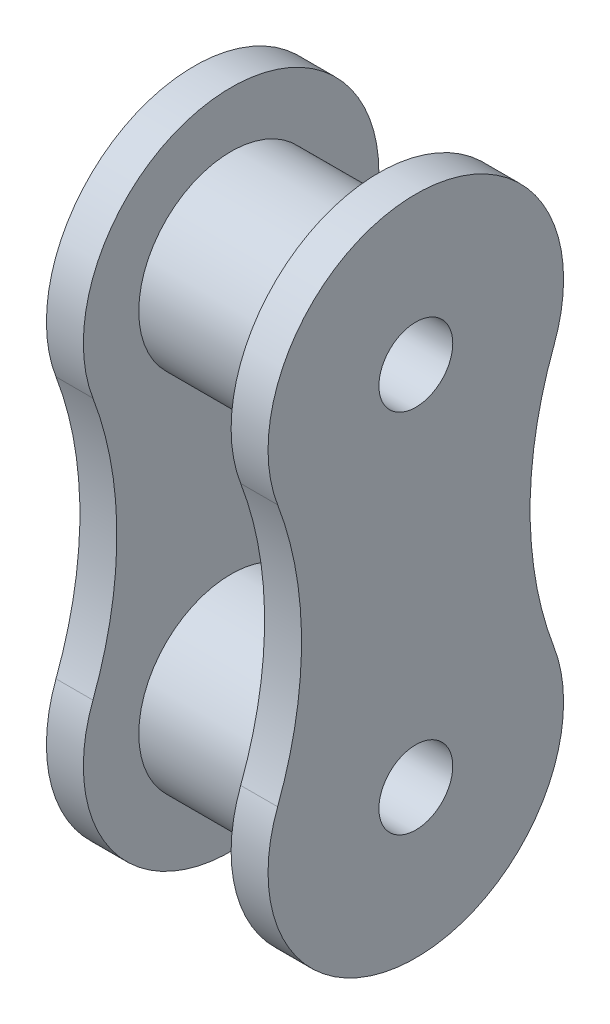
ISO-10303-21;
HEADER;
FILE_DESCRIPTION(('STEP AP214'),'2;1');
FILE_NAME('part.step','',(''),(''),'','','');
FILE_SCHEMA(('AUTOMOTIVE_DESIGN { 1 0 10303 214 1 1 1 1 }'));
ENDSEC;
DATA;
#1=APPLICATION_CONTEXT('core data for automotive mechanical design processes');
#2=APPLICATION_PROTOCOL_DEFINITION('international standard','automotive_design',2000,#1);
#3=PRODUCT_CONTEXT('',#1,'mechanical');
#4=PRODUCT('Part','Part','',(#3));
#5=PRODUCT_RELATED_PRODUCT_CATEGORY('part','',(#4));
#6=PRODUCT_DEFINITION_FORMATION('','',#4);
#7=PRODUCT_DEFINITION_CONTEXT('part definition',#1,'design');
#8=PRODUCT_DEFINITION('design','',#6,#7);
#9=PRODUCT_DEFINITION_SHAPE('','',#8);
#10=(LENGTH_UNIT() NAMED_UNIT(*) SI_UNIT(.MILLI.,.METRE.));
#11=(NAMED_UNIT(*) PLANE_ANGLE_UNIT() SI_UNIT($,.RADIAN.));
#12=(NAMED_UNIT(*) SI_UNIT($,.STERADIAN.) SOLID_ANGLE_UNIT());
#13=UNCERTAINTY_MEASURE_WITH_UNIT(LENGTH_MEASURE(1.E-05),#10,'distance_accuracy_value','');
#14=(GEOMETRIC_REPRESENTATION_CONTEXT(3) GLOBAL_UNCERTAINTY_ASSIGNED_CONTEXT((#13)) GLOBAL_UNIT_ASSIGNED_CONTEXT((#10,
#11,#12)) REPRESENTATION_CONTEXT('',''));
#15=CARTESIAN_POINT('',(0.,0.,0.));
#16=DIRECTION('',(0.,0.,1.));
#17=DIRECTION('',(1.,0.,0.));
#18=AXIS2_PLACEMENT_3D('',#15,#16,#17);
#19=CARTESIAN_POINT('',(2.5,-4.955,0.));
#20=DIRECTION('',(-1.,0.,0.));
#21=DIRECTION('',(0.,0.,1.));
#22=AXIS2_PLACEMENT_3D('',#19,#20,#21);
#23=CYLINDRICAL_SURFACE('',#22,2.5);
#24=CARTESIAN_POINT('',(2.,-4.955,0.));
#25=DIRECTION('',(1.,0.,0.));
#26=DIRECTION('',(0.,0.,-1.));
#27=AXIS2_PLACEMENT_3D('',#24,#25,#26);
#28=CIRCLE('',#27,2.5);
#29=CARTESIAN_POINT('',(2.,-4.955,-2.5));
#30=VERTEX_POINT('',#29);
#31=EDGE_CURVE('E186',#30,#30,#28,.T.);
#32=ORIENTED_EDGE('',*,*,#31,.F.);
#33=EDGE_LOOP('',(#32));
#34=FACE_BOUND('',#33,.T.);
#35=CARTESIAN_POINT('',(-2.,-4.955,0.));
#36=DIRECTION('',(-1.,0.,0.));
#37=DIRECTION('',(0.,0.,1.));
#38=AXIS2_PLACEMENT_3D('',#35,#36,#37);
#39=CIRCLE('',#38,2.5);
#40=CARTESIAN_POINT('',(-2.,-4.955,2.5));
#41=VERTEX_POINT('',#40);
#42=EDGE_CURVE('E11',#41,#41,#39,.T.);
#43=ORIENTED_EDGE('',*,*,#42,.F.);
#44=EDGE_LOOP('',(#43));
#45=FACE_BOUND('',#44,.T.);
#46=ADVANCED_FACE('F44',(#34,#45),#23,.T.);
#47=CARTESIAN_POINT('',(2.5,4.955,0.));
#48=DIRECTION('',(-1.,0.,0.));
#49=DIRECTION('',(0.,0.,1.));
#50=AXIS2_PLACEMENT_3D('',#47,#48,#49);
#51=CYLINDRICAL_SURFACE('',#50,2.5);
#52=CARTESIAN_POINT('',(2.,4.955,0.));
#53=DIRECTION('',(1.,0.,0.));
#54=DIRECTION('',(0.,0.,-1.));
#55=AXIS2_PLACEMENT_3D('',#52,#53,#54);
#56=CIRCLE('',#55,2.5);
#57=CARTESIAN_POINT('',(2.,4.955,-2.5));
#58=VERTEX_POINT('',#57);
#59=EDGE_CURVE('E188',#58,#58,#56,.F.);
#60=ORIENTED_EDGE('',*,*,#59,.T.);
#61=EDGE_LOOP('',(#60));
#62=FACE_BOUND('',#61,.T.);
#63=CARTESIAN_POINT('',(-2.,4.955,0.));
#64=DIRECTION('',(-1.,0.,0.));
#65=DIRECTION('',(0.,0.,1.));
#66=AXIS2_PLACEMENT_3D('',#63,#64,#65);
#67=CIRCLE('',#66,2.5);
#68=CARTESIAN_POINT('',(-2.,4.955,2.5));
#69=VERTEX_POINT('',#68);
#70=EDGE_CURVE('E48',#69,#69,#67,.T.);
#71=ORIENTED_EDGE('',*,*,#70,.F.);
#72=EDGE_LOOP('',(#71));
#73=FACE_BOUND('',#72,.T.);
#74=ADVANCED_FACE('F200',(#62,#73),#51,.T.);
#75=CARTESIAN_POINT('',(3.,-4.955,0.));
#76=DIRECTION('',(-1.,0.,0.));
#77=DIRECTION('',(0.,0.,1.));
#78=AXIS2_PLACEMENT_3D('',#75,#76,#77);
#79=CYLINDRICAL_SURFACE('',#78,4.);
#80=CARTESIAN_POINT('',(2.,-4.955,0.));
#81=DIRECTION('',(1.,0.,0.));
#82=DIRECTION('',(0.,0.,-1.));
#83=AXIS2_PLACEMENT_3D('',#80,#81,#82);
#84=CIRCLE('',#83,4.);
#85=CARTESIAN_POINT('',(2.,-3.53928571428571,3.74108982266191));
#86=VERTEX_POINT('',#85);
#87=CARTESIAN_POINT('',(2.,-3.53928571428571,-3.74108982266191));
#88=VERTEX_POINT('',#87);
#89=EDGE_CURVE('E130',#86,#88,#84,.T.);
#90=ORIENTED_EDGE('',*,*,#89,.T.);
#91=DIRECTION('',(-1.,0.,0.));
#92=VECTOR('',#91,1.);
#93=CARTESIAN_POINT('',(3.,-3.53928571428571,-3.74108982266191));
#94=LINE('',#93,#92);
#95=CARTESIAN_POINT('',(3.,-3.53928571428571,-3.74108982266191));
#96=VERTEX_POINT('',#95);
#97=EDGE_CURVE('E183',#96,#88,#94,.T.);
#98=ORIENTED_EDGE('',*,*,#97,.F.);
#99=CARTESIAN_POINT('',(3.,-4.955,0.));
#100=DIRECTION('',(1.,0.,0.));
#101=DIRECTION('',(0.,0.,-1.));
#102=AXIS2_PLACEMENT_3D('',#99,#100,#101);
#103=CIRCLE('',#102,4.);
#104=CARTESIAN_POINT('',(3.,-3.53928571428571,3.74108982266191));
#105=VERTEX_POINT('',#104);
#106=EDGE_CURVE('E162',#105,#96,#103,.T.);
#107=ORIENTED_EDGE('',*,*,#106,.F.);
#108=DIRECTION('',(-1.,0.,0.));
#109=VECTOR('',#108,1.);
#110=CARTESIAN_POINT('',(3.,-3.53928571428571,3.74108982266191));
#111=LINE('',#110,#109);
#112=EDGE_CURVE('E61',#105,#86,#111,.T.);
#113=ORIENTED_EDGE('',*,*,#112,.T.);
#114=EDGE_LOOP('',(#90,#98,#107,#113));
#115=FACE_BOUND('',#114,.T.);
#116=ADVANCED_FACE('F203',(#115),#79,.T.);
#117=CARTESIAN_POINT('',(3.,0.,-13.0938143793167));
#118=DIRECTION('',(-1.,0.,0.));
#119=DIRECTION('',(0.,0.,1.));
#120=AXIS2_PLACEMENT_3D('',#117,#118,#119);
#121=CYLINDRICAL_SURFACE('',#120,10.);
#122=CARTESIAN_POINT('',(2.,0.,-13.0938143793167));
#123=DIRECTION('',(1.,0.,0.));
#124=DIRECTION('',(0.,0.,-1.));
#125=AXIS2_PLACEMENT_3D('',#122,#123,#124);
#126=CIRCLE('',#125,10.);
#127=CARTESIAN_POINT('',(2.,3.53928571428571,-3.74108982266191));
#128=VERTEX_POINT('',#127);
#129=EDGE_CURVE('E175',#88,#128,#126,.F.);
#130=ORIENTED_EDGE('',*,*,#129,.T.);
#131=DIRECTION('',(-1.,0.,0.));
#132=VECTOR('',#131,1.);
#133=CARTESIAN_POINT('',(3.,3.53928571428571,-3.74108982266191));
#134=LINE('',#133,#132);
#135=CARTESIAN_POINT('',(3.,3.53928571428571,-3.74108982266191));
#136=VERTEX_POINT('',#135);
#137=EDGE_CURVE('E181',#136,#128,#134,.T.);
#138=ORIENTED_EDGE('',*,*,#137,.F.);
#139=CARTESIAN_POINT('',(3.,0.,-13.0938143793167));
#140=DIRECTION('',(1.,0.,0.));
#141=DIRECTION('',(0.,0.,-1.));
#142=AXIS2_PLACEMENT_3D('',#139,#140,#141);
#143=CIRCLE('',#142,10.);
#144=EDGE_CURVE('E90',#96,#136,#143,.F.);
#145=ORIENTED_EDGE('',*,*,#144,.F.);
#146=ORIENTED_EDGE('',*,*,#97,.T.);
#147=EDGE_LOOP('',(#130,#138,#145,#146));
#148=FACE_BOUND('',#147,.T.);
#149=ADVANCED_FACE('F208',(#148),#121,.F.);
#150=CARTESIAN_POINT('',(3.,4.955,0.));
#151=DIRECTION('',(-1.,0.,0.));
#152=DIRECTION('',(0.,0.,1.));
#153=AXIS2_PLACEMENT_3D('',#150,#151,#152);
#154=CYLINDRICAL_SURFACE('',#153,4.);
#155=CARTESIAN_POINT('',(2.,4.955,0.));
#156=DIRECTION('',(1.,0.,0.));
#157=DIRECTION('',(0.,0.,-1.));
#158=AXIS2_PLACEMENT_3D('',#155,#156,#157);
#159=CIRCLE('',#158,4.);
#160=CARTESIAN_POINT('',(2.,3.53928571428571,3.74108982266191));
#161=VERTEX_POINT('',#160);
#162=EDGE_CURVE('E176',#161,#128,#159,.F.);
#163=ORIENTED_EDGE('',*,*,#162,.F.);
#164=DIRECTION('',(-1.,0.,0.));
#165=VECTOR('',#164,1.);
#166=CARTESIAN_POINT('',(3.,3.53928571428571,3.74108982266191));
#167=LINE('',#166,#165);
#168=CARTESIAN_POINT('',(3.,3.53928571428571,3.74108982266191));
#169=VERTEX_POINT('',#168);
#170=EDGE_CURVE('E76',#169,#161,#167,.T.);
#171=ORIENTED_EDGE('',*,*,#170,.F.);
#172=CARTESIAN_POINT('',(3.,4.955,0.));
#173=DIRECTION('',(1.,0.,0.));
#174=DIRECTION('',(0.,0.,-1.));
#175=AXIS2_PLACEMENT_3D('',#172,#173,#174);
#176=CIRCLE('',#175,4.);
#177=EDGE_CURVE('E170',#169,#136,#176,.F.);
#178=ORIENTED_EDGE('',*,*,#177,.T.);
#179=ORIENTED_EDGE('',*,*,#137,.T.);
#180=EDGE_LOOP('',(#163,#171,#178,#179));
#181=FACE_BOUND('',#180,.T.);
#182=ADVANCED_FACE('F221',(#181),#154,.T.);
#183=CARTESIAN_POINT('',(3.,0.,13.0938143793167));
#184=DIRECTION('',(-1.,0.,0.));
#185=DIRECTION('',(0.,0.,1.));
#186=AXIS2_PLACEMENT_3D('',#183,#184,#185);
#187=CYLINDRICAL_SURFACE('',#186,10.);
#188=CARTESIAN_POINT('',(2.,0.,13.0938143793167));
#189=DIRECTION('',(1.,0.,0.));
#190=DIRECTION('',(0.,0.,-1.));
#191=AXIS2_PLACEMENT_3D('',#188,#189,#190);
#192=CIRCLE('',#191,10.);
#193=EDGE_CURVE('E164',#86,#161,#192,.T.);
#194=ORIENTED_EDGE('',*,*,#193,.F.);
#195=ORIENTED_EDGE('',*,*,#112,.F.);
#196=CARTESIAN_POINT('',(3.,0.,13.0938143793167));
#197=DIRECTION('',(1.,0.,0.));
#198=DIRECTION('',(0.,0.,-1.));
#199=AXIS2_PLACEMENT_3D('',#196,#197,#198);
#200=CIRCLE('',#199,10.);
#201=EDGE_CURVE('E168',#105,#169,#200,.T.);
#202=ORIENTED_EDGE('',*,*,#201,.T.);
#203=ORIENTED_EDGE('',*,*,#170,.T.);
#204=EDGE_LOOP('',(#194,#195,#202,#203));
#205=FACE_BOUND('',#204,.T.);
#206=ADVANCED_FACE('F220',(#205),#187,.F.);
#207=CARTESIAN_POINT('',(3.,0.,0.));
#208=DIRECTION('',(1.,0.,0.));
#209=DIRECTION('',(0.,0.,-1.));
#210=AXIS2_PLACEMENT_3D('',#207,#208,#209);
#211=PLANE('',#210);
#212=CARTESIAN_POINT('',(3.,-4.955,0.));
#213=DIRECTION('',(1.,0.,0.));
#214=DIRECTION('',(0.,0.,-1.));
#215=AXIS2_PLACEMENT_3D('',#212,#213,#214);
#216=CIRCLE('',#215,1.);
#217=CARTESIAN_POINT('',(3.,-4.955,-0.999999999999999));
#218=VERTEX_POINT('',#217);
#219=EDGE_CURVE('E353',#218,#218,#216,.T.);
#220=ORIENTED_EDGE('',*,*,#219,.F.);
#221=EDGE_LOOP('',(#220));
#222=FACE_BOUND('',#221,.T.);
#223=CARTESIAN_POINT('',(3.,4.955,0.));
#224=DIRECTION('',(1.,0.,0.));
#225=DIRECTION('',(0.,0.,-1.));
#226=AXIS2_PLACEMENT_3D('',#223,#224,#225);
#227=CIRCLE('',#226,1.);
#228=CARTESIAN_POINT('',(3.,4.955,-0.999999999999997));
#229=VERTEX_POINT('',#228);
#230=EDGE_CURVE('E352',#229,#229,#227,.T.);
#231=ORIENTED_EDGE('',*,*,#230,.F.);
#232=EDGE_LOOP('',(#231));
#233=FACE_BOUND('',#232,.T.);
#234=ORIENTED_EDGE('',*,*,#106,.T.);
#235=ORIENTED_EDGE('',*,*,#144,.T.);
#236=ORIENTED_EDGE('',*,*,#177,.F.);
#237=ORIENTED_EDGE('',*,*,#201,.F.);
#238=EDGE_LOOP('',(#234,#235,#236,#237));
#239=FACE_BOUND('',#238,.T.);
#240=ADVANCED_FACE('F213',(#222,#233,#239),#211,.T.);
#241=CARTESIAN_POINT('',(2.,0.,0.));
#242=DIRECTION('',(1.,0.,0.));
#243=DIRECTION('',(0.,0.,-1.));
#244=AXIS2_PLACEMENT_3D('',#241,#242,#243);
#245=PLANE('',#244);
#246=ORIENTED_EDGE('',*,*,#59,.F.);
#247=EDGE_LOOP('',(#246));
#248=FACE_BOUND('',#247,.T.);
#249=ORIENTED_EDGE('',*,*,#31,.T.);
#250=EDGE_LOOP('',(#249));
#251=FACE_BOUND('',#250,.T.);
#252=ORIENTED_EDGE('',*,*,#89,.F.);
#253=ORIENTED_EDGE('',*,*,#193,.T.);
#254=ORIENTED_EDGE('',*,*,#162,.T.);
#255=ORIENTED_EDGE('',*,*,#129,.F.);
#256=EDGE_LOOP('',(#252,#253,#254,#255));
#257=FACE_BOUND('',#256,.T.);
#258=ADVANCED_FACE('F216',(#248,#251,#257),#245,.F.);
#259=CARTESIAN_POINT('',(-3.,-4.955,0.));
#260=DIRECTION('',(1.,0.,0.));
#261=DIRECTION('',(0.,0.,-1.));
#262=AXIS2_PLACEMENT_3D('',#259,#260,#261);
#263=CYLINDRICAL_SURFACE('',#262,4.);
#264=CARTESIAN_POINT('',(-2.,-4.955,0.));
#265=DIRECTION('',(1.,0.,0.));
#266=DIRECTION('',(0.,0.,-1.));
#267=AXIS2_PLACEMENT_3D('',#264,#265,#266);
#268=CIRCLE('',#267,4.);
#269=CARTESIAN_POINT('',(-2.,-3.53928571428571,3.74108982266191));
#270=VERTEX_POINT('',#269);
#271=CARTESIAN_POINT('',(-2.,-3.53928571428571,-3.74108982266191));
#272=VERTEX_POINT('',#271);
#273=EDGE_CURVE('E122',#270,#272,#268,.T.);
#274=ORIENTED_EDGE('',*,*,#273,.F.);
#275=DIRECTION('',(1.,0.,0.));
#276=VECTOR('',#275,1.);
#277=CARTESIAN_POINT('',(-3.,-3.53928571428571,3.74108982266191));
#278=LINE('',#277,#276);
#279=CARTESIAN_POINT('',(-3.,-3.53928571428571,3.74108982266191));
#280=VERTEX_POINT('',#279);
#281=EDGE_CURVE('E116',#280,#270,#278,.T.);
#282=ORIENTED_EDGE('',*,*,#281,.F.);
#283=CARTESIAN_POINT('',(-3.,-4.955,0.));
#284=DIRECTION('',(1.,0.,0.));
#285=DIRECTION('',(0.,0.,-1.));
#286=AXIS2_PLACEMENT_3D('',#283,#284,#285);
#287=CIRCLE('',#286,4.);
#288=CARTESIAN_POINT('',(-3.,-3.53928571428571,-3.74108982266191));
#289=VERTEX_POINT('',#288);
#290=EDGE_CURVE('E121',#280,#289,#287,.T.);
#291=ORIENTED_EDGE('',*,*,#290,.T.);
#292=DIRECTION('',(1.,0.,0.));
#293=VECTOR('',#292,1.);
#294=CARTESIAN_POINT('',(-3.,-3.53928571428571,-3.74108982266191));
#295=LINE('',#294,#293);
#296=EDGE_CURVE('E155',#289,#272,#295,.T.);
#297=ORIENTED_EDGE('',*,*,#296,.T.);
#298=EDGE_LOOP('',(#274,#282,#291,#297));
#299=FACE_BOUND('',#298,.T.);
#300=ADVANCED_FACE('F118',(#299),#263,.T.);
#301=CARTESIAN_POINT('',(-3.,0.,13.0938143793167));
#302=DIRECTION('',(1.,0.,0.));
#303=DIRECTION('',(0.,0.,-1.));
#304=AXIS2_PLACEMENT_3D('',#301,#302,#303);
#305=CYLINDRICAL_SURFACE('',#304,10.);
#306=CARTESIAN_POINT('',(-2.,0.,13.0938143793167));
#307=DIRECTION('',(1.,0.,0.));
#308=DIRECTION('',(0.,0.,-1.));
#309=AXIS2_PLACEMENT_3D('',#306,#307,#308);
#310=CIRCLE('',#309,10.);
#311=CARTESIAN_POINT('',(-2.,3.53928571428571,3.74108982266191));
#312=VERTEX_POINT('',#311);
#313=EDGE_CURVE('E152',#270,#312,#310,.T.);
#314=ORIENTED_EDGE('',*,*,#313,.T.);
#315=DIRECTION('',(1.,0.,0.));
#316=VECTOR('',#315,1.);
#317=CARTESIAN_POINT('',(-3.,3.53928571428571,3.74108982266191));
#318=LINE('',#317,#316);
#319=CARTESIAN_POINT('',(-3.,3.53928571428571,3.74108982266191));
#320=VERTEX_POINT('',#319);
#321=EDGE_CURVE('E126',#320,#312,#318,.T.);
#322=ORIENTED_EDGE('',*,*,#321,.F.);
#323=CARTESIAN_POINT('',(-3.,0.,13.0938143793167));
#324=DIRECTION('',(1.,0.,0.));
#325=DIRECTION('',(0.,0.,-1.));
#326=AXIS2_PLACEMENT_3D('',#323,#324,#325);
#327=CIRCLE('',#326,10.);
#328=EDGE_CURVE('E134',#280,#320,#327,.T.);
#329=ORIENTED_EDGE('',*,*,#328,.F.);
#330=ORIENTED_EDGE('',*,*,#281,.T.);
#331=EDGE_LOOP('',(#314,#322,#329,#330));
#332=FACE_BOUND('',#331,.T.);
#333=ADVANCED_FACE('F131',(#332),#305,.F.);
#334=CARTESIAN_POINT('',(-3.,4.955,0.));
#335=DIRECTION('',(1.,0.,0.));
#336=DIRECTION('',(0.,0.,-1.));
#337=AXIS2_PLACEMENT_3D('',#334,#335,#336);
#338=CYLINDRICAL_SURFACE('',#337,4.);
#339=CARTESIAN_POINT('',(-2.,4.955,0.));
#340=DIRECTION('',(1.,0.,0.));
#341=DIRECTION('',(0.,0.,-1.));
#342=AXIS2_PLACEMENT_3D('',#339,#340,#341);
#343=CIRCLE('',#342,4.);
#344=CARTESIAN_POINT('',(-2.,3.53928571428571,-3.74108982266191));
#345=VERTEX_POINT('',#344);
#346=EDGE_CURVE('E145',#312,#345,#343,.F.);
#347=ORIENTED_EDGE('',*,*,#346,.T.);
#348=DIRECTION('',(1.,0.,0.));
#349=VECTOR('',#348,1.);
#350=CARTESIAN_POINT('',(-3.,3.53928571428571,-3.74108982266191));
#351=LINE('',#350,#349);
#352=CARTESIAN_POINT('',(-3.,3.53928571428571,-3.74108982266191));
#353=VERTEX_POINT('',#352);
#354=EDGE_CURVE('E159',#353,#345,#351,.T.);
#355=ORIENTED_EDGE('',*,*,#354,.F.);
#356=CARTESIAN_POINT('',(-3.,4.955,0.));
#357=DIRECTION('',(1.,0.,0.));
#358=DIRECTION('',(0.,0.,-1.));
#359=AXIS2_PLACEMENT_3D('',#356,#357,#358);
#360=CIRCLE('',#359,4.);
#361=EDGE_CURVE('E136',#320,#353,#360,.F.);
#362=ORIENTED_EDGE('',*,*,#361,.F.);
#363=ORIENTED_EDGE('',*,*,#321,.T.);
#364=EDGE_LOOP('',(#347,#355,#362,#363));
#365=FACE_BOUND('',#364,.T.);
#366=ADVANCED_FACE('F279',(#365),#338,.T.);
#367=CARTESIAN_POINT('',(-3.,0.,-13.0938143793167));
#368=DIRECTION('',(1.,0.,0.));
#369=DIRECTION('',(0.,0.,-1.));
#370=AXIS2_PLACEMENT_3D('',#367,#368,#369);
#371=CYLINDRICAL_SURFACE('',#370,10.);
#372=CARTESIAN_POINT('',(-2.,0.,-13.0938143793167));
#373=DIRECTION('',(1.,0.,0.));
#374=DIRECTION('',(0.,0.,-1.));
#375=AXIS2_PLACEMENT_3D('',#372,#373,#374);
#376=CIRCLE('',#375,10.);
#377=EDGE_CURVE('E143',#272,#345,#376,.F.);
#378=ORIENTED_EDGE('',*,*,#377,.F.);
#379=ORIENTED_EDGE('',*,*,#296,.F.);
#380=CARTESIAN_POINT('',(-3.,0.,-13.0938143793167));
#381=DIRECTION('',(1.,0.,0.));
#382=DIRECTION('',(0.,0.,-1.));
#383=AXIS2_PLACEMENT_3D('',#380,#381,#382);
#384=CIRCLE('',#383,10.);
#385=EDGE_CURVE('E139',#289,#353,#384,.F.);
#386=ORIENTED_EDGE('',*,*,#385,.T.);
#387=ORIENTED_EDGE('',*,*,#354,.T.);
#388=EDGE_LOOP('',(#378,#379,#386,#387));
#389=FACE_BOUND('',#388,.T.);
#390=ADVANCED_FACE('F286',(#389),#371,.F.);
#391=CARTESIAN_POINT('',(-3.,0.,0.));
#392=DIRECTION('',(-1.,0.,0.));
#393=DIRECTION('',(0.,0.,-1.));
#394=AXIS2_PLACEMENT_3D('',#391,#392,#393);
#395=PLANE('',#394);
#396=CARTESIAN_POINT('',(-3.,-4.955,0.));
#397=DIRECTION('',(1.,0.,0.));
#398=DIRECTION('',(0.,0.,-1.));
#399=AXIS2_PLACEMENT_3D('',#396,#397,#398);
#400=CIRCLE('',#399,1.);
#401=CARTESIAN_POINT('',(-3.,-4.955,-0.999999999999999));
#402=VERTEX_POINT('',#401);
#403=EDGE_CURVE('E154',#402,#402,#400,.T.);
#404=ORIENTED_EDGE('',*,*,#403,.T.);
#405=EDGE_LOOP('',(#404));
#406=FACE_BOUND('',#405,.T.);
#407=CARTESIAN_POINT('',(-3.,4.955,0.));
#408=DIRECTION('',(1.,0.,0.));
#409=DIRECTION('',(0.,0.,-1.));
#410=AXIS2_PLACEMENT_3D('',#407,#408,#409);
#411=CIRCLE('',#410,1.);
#412=CARTESIAN_POINT('',(-3.,4.955,-0.999999999999997));
#413=VERTEX_POINT('',#412);
#414=EDGE_CURVE('E150',#413,#413,#411,.T.);
#415=ORIENTED_EDGE('',*,*,#414,.T.);
#416=EDGE_LOOP('',(#415));
#417=FACE_BOUND('',#416,.T.);
#418=ORIENTED_EDGE('',*,*,#290,.F.);
#419=ORIENTED_EDGE('',*,*,#328,.T.);
#420=ORIENTED_EDGE('',*,*,#361,.T.);
#421=ORIENTED_EDGE('',*,*,#385,.F.);
#422=EDGE_LOOP('',(#418,#419,#420,#421));
#423=FACE_BOUND('',#422,.T.);
#424=ADVANCED_FACE('F138',(#406,#417,#423),#395,.T.);
#425=CARTESIAN_POINT('',(-2.,0.,0.));
#426=DIRECTION('',(-1.,0.,0.));
#427=DIRECTION('',(0.,0.,-1.));
#428=AXIS2_PLACEMENT_3D('',#425,#426,#427);
#429=PLANE('',#428);
#430=ORIENTED_EDGE('',*,*,#42,.T.);
#431=EDGE_LOOP('',(#430));
#432=FACE_BOUND('',#431,.T.);
#433=ORIENTED_EDGE('',*,*,#70,.T.);
#434=EDGE_LOOP('',(#433));
#435=FACE_BOUND('',#434,.T.);
#436=ORIENTED_EDGE('',*,*,#273,.T.);
#437=ORIENTED_EDGE('',*,*,#377,.T.);
#438=ORIENTED_EDGE('',*,*,#346,.F.);
#439=ORIENTED_EDGE('',*,*,#313,.F.);
#440=EDGE_LOOP('',(#436,#437,#438,#439));
#441=FACE_BOUND('',#440,.T.);
#442=ADVANCED_FACE('F198',(#432,#435,#441),#429,.F.);
#443=CARTESIAN_POINT('',(-3.,4.955,0.));
#444=DIRECTION('',(1.,0.,0.));
#445=DIRECTION('',(0.,0.,-1.));
#446=AXIS2_PLACEMENT_3D('',#443,#444,#445);
#447=CYLINDRICAL_SURFACE('',#446,1.);
#448=ORIENTED_EDGE('',*,*,#414,.F.);
#449=EDGE_LOOP('',(#448));
#450=FACE_BOUND('',#449,.T.);
#451=ORIENTED_EDGE('',*,*,#230,.T.);
#452=EDGE_LOOP('',(#451));
#453=FACE_BOUND('',#452,.T.);
#454=ADVANCED_FACE('F321',(#450,#453),#447,.F.);
#455=CARTESIAN_POINT('',(-3.,-4.955,0.));
#456=DIRECTION('',(1.,0.,0.));
#457=DIRECTION('',(0.,0.,-1.));
#458=AXIS2_PLACEMENT_3D('',#455,#456,#457);
#459=CYLINDRICAL_SURFACE('',#458,1.);
#460=ORIENTED_EDGE('',*,*,#403,.F.);
#461=EDGE_LOOP('',(#460));
#462=FACE_BOUND('',#461,.T.);
#463=ORIENTED_EDGE('',*,*,#219,.T.);
#464=EDGE_LOOP('',(#463));
#465=FACE_BOUND('',#464,.T.);
#466=ADVANCED_FACE('F339',(#462,#465),#459,.F.);
#467=CLOSED_SHELL('',(#46,#74,#116,#149,#182,#206,#240,#258,#300,#333,#366,#390,#424,#442,#454,#466));
#468=MANIFOLD_SOLID_BREP('B2',#467);
#469=ADVANCED_BREP_SHAPE_REPRESENTATION('',(#18,#468),#14);
#470=SHAPE_DEFINITION_REPRESENTATION(#9,#469);
ENDSEC;
END-ISO-10303-21;
